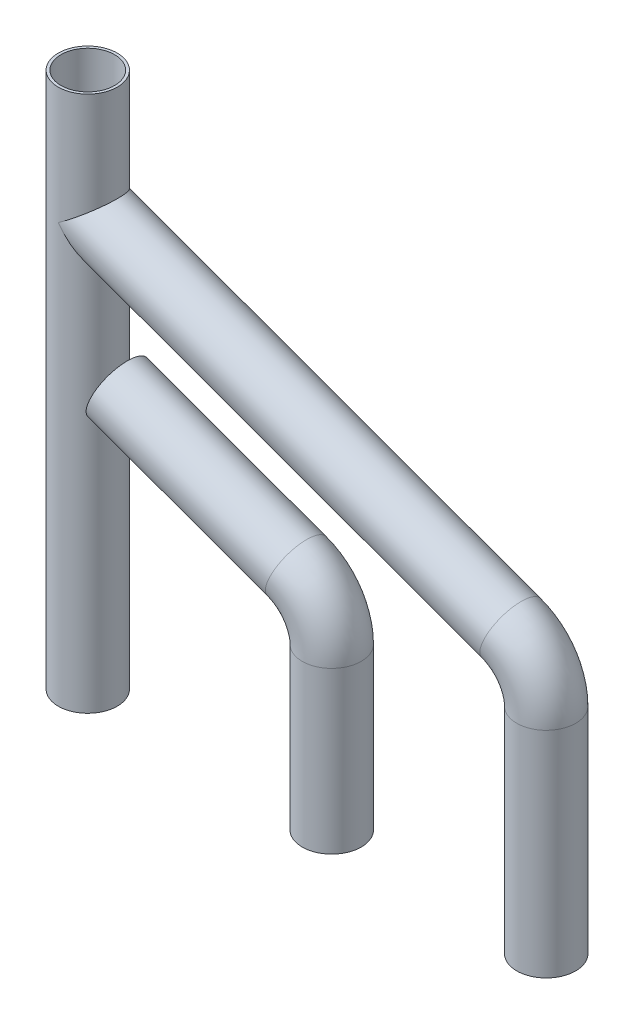
ISO-10303-21;
HEADER;
FILE_DESCRIPTION(('STEP AP214'),'2;1');
FILE_NAME('part.step','',(''),(''),'','','');
FILE_SCHEMA(('AUTOMOTIVE_DESIGN { 1 0 10303 214 1 1 1 1 }'));
ENDSEC;
DATA;
#1=APPLICATION_CONTEXT('core data for automotive mechanical design processes');
#2=APPLICATION_PROTOCOL_DEFINITION('international standard','automotive_design',2000,#1);
#3=PRODUCT_CONTEXT('',#1,'mechanical');
#4=PRODUCT('Part','Part','',(#3));
#5=PRODUCT_RELATED_PRODUCT_CATEGORY('part','',(#4));
#6=PRODUCT_DEFINITION_FORMATION('','',#4);
#7=PRODUCT_DEFINITION_CONTEXT('part definition',#1,'design');
#8=PRODUCT_DEFINITION('design','',#6,#7);
#9=PRODUCT_DEFINITION_SHAPE('','',#8);
#10=(LENGTH_UNIT() NAMED_UNIT(*) SI_UNIT(.MILLI.,.METRE.));
#11=(NAMED_UNIT(*) PLANE_ANGLE_UNIT() SI_UNIT($,.RADIAN.));
#12=(NAMED_UNIT(*) SI_UNIT($,.STERADIAN.) SOLID_ANGLE_UNIT());
#13=UNCERTAINTY_MEASURE_WITH_UNIT(LENGTH_MEASURE(1.E-05),#10,'distance_accuracy_value','');
#14=(GEOMETRIC_REPRESENTATION_CONTEXT(3) GLOBAL_UNCERTAINTY_ASSIGNED_CONTEXT((#13)) GLOBAL_UNIT_ASSIGNED_CONTEXT((#10,
#11,#12)) REPRESENTATION_CONTEXT('',''));
#15=CARTESIAN_POINT('',(0.,0.,0.));
#16=DIRECTION('',(0.,0.,1.));
#17=DIRECTION('',(1.,0.,0.));
#18=AXIS2_PLACEMENT_3D('',#15,#16,#17);
#19=CARTESIAN_POINT('',(0.,127.,0.));
#20=DIRECTION('',(0.,-1.,0.));
#21=DIRECTION('',(0.,0.,-1.));
#22=AXIS2_PLACEMENT_3D('',#19,#20,#21);
#23=CYLINDRICAL_SURFACE('',#22,6.985);
#24=CARTESIAN_POINT('',(0.,46.2911938610954,0.));
#25=DIRECTION('',(0.939692620785909,-0.342020143325665,0.));
#26=DIRECTION('',(-0.342020143325666,-0.93969262078591,0.));
#27=AXIS2_PLACEMENT_3D('',#24,#25,#26);
#28=ELLIPSE('',#27,20.4227737351394,6.985);
#29=CARTESIAN_POINT('',(5.20483990850574,60.5913739815914,-4.65831155321604));
#30=VERTEX_POINT('',#29);
#31=CARTESIAN_POINT('',(5.42076742573765,61.1846299594249,-4.40516804629082));
#32=VERTEX_POINT('',#31);
#33=EDGE_CURVE('E231',#30,#32,#28,.T.);
#34=ORIENTED_EDGE('',*,*,#33,.F.);
#35=CARTESIAN_POINT('',(0.,68.0246557223356,0.));
#36=DIRECTION('',(-0.819152044288991,-0.573576436351047,0.));
#37=DIRECTION('',(0.573576436351047,-0.819152044288991,0.));
#38=AXIS2_PLACEMENT_3D('',#35,#36,#37);
#39=ELLIPSE('',#38,12.1779758674133,6.985);
#40=CARTESIAN_POINT('',(5.20483990850574,60.5913739815914,4.65831155321604));
#41=VERTEX_POINT('',#40);
#42=EDGE_CURVE('E276',#30,#41,#39,.T.);
#43=ORIENTED_EDGE('',*,*,#42,.T.);
#44=CARTESIAN_POINT('',(5.42076742573765,61.1846299594249,4.40516804629082));
#45=VERTEX_POINT('',#44);
#46=EDGE_CURVE('E149',#45,#41,#28,.T.);
#47=ORIENTED_EDGE('',*,*,#46,.F.);
#48=CARTESIAN_POINT('',(5.42076742573765,61.1846299594249,4.40516804629082));
#49=CARTESIAN_POINT('',(5.50688476329087,61.0446768816568,4.2991595484523));
#50=CARTESIAN_POINT('',(5.59186751407775,60.9075905049412,4.18826555741038));
#51=CARTESIAN_POINT('',(5.75869826296238,60.6400722078168,3.95578485884568));
#52=CARTESIAN_POINT('',(5.84053801573785,60.5096575272873,3.83417246250436));
#53=CARTESIAN_POINT('',(6.00092421308625,60.2552946102483,3.57802532963901));
#54=CARTESIAN_POINT('',(6.07940656763278,60.1314659834554,3.44333023636312));
#55=CARTESIAN_POINT('',(6.2303129400432,59.8942942403671,3.16209977708398));
#56=CARTESIAN_POINT('',(6.30274303173212,59.7809405993639,3.01557657895226));
#57=CARTESIAN_POINT('',(6.46417361376778,59.529076830873,2.65630250007065));
#58=CARTESIAN_POINT('',(6.55003480432772,59.3957529415076,2.43839182053198));
#59=CARTESIAN_POINT('',(6.70240237685557,59.1598153309443,1.98131538364937));
#60=CARTESIAN_POINT('',(6.76900042859199,59.0570560896182,1.74225761042003));
#61=CARTESIAN_POINT('',(6.86899373953028,58.9030161027488,1.28556041608288));
#62=CARTESIAN_POINT('',(6.90600046468739,58.8461232897926,1.07063219773384));
#63=CARTESIAN_POINT('',(6.95982497029777,58.76342534716,0.632243326124323));
#64=CARTESIAN_POINT('',(6.97664301159798,58.7376198158218,0.408782783143841));
#65=CARTESIAN_POINT('',(6.98850442034003,58.719416537717,-0.0406016039630629));
#66=CARTESIAN_POINT('',(6.98349961319687,58.7270927028,-0.266529798582886));
#67=CARTESIAN_POINT('',(6.95209695756699,58.775301628972,-0.713290725597633));
#68=CARTESIAN_POINT('',(6.92569343044529,58.815843111618,-0.934122089432437));
#69=CARTESIAN_POINT('',(6.85486007246428,58.9247855870537,-1.35875353236183));
#70=CARTESIAN_POINT('',(6.81096168126243,58.9923654563658,-1.56285876975073));
#71=CARTESIAN_POINT('',(6.70818111059067,59.1509554162643,-1.9576068612387));
#72=CARTESIAN_POINT('',(6.64929164897342,59.2419768942314,-2.14824311490644));
#73=CARTESIAN_POINT('',(6.47995821235158,59.5044909813695,-2.62645347994145));
#74=CARTESIAN_POINT('',(6.35996105626465,59.6912285530938,-2.90234238748409));
#75=CARTESIAN_POINT('',(6.16480851476371,59.9971310331551,-3.28728051255804));
#76=CARTESIAN_POINT('',(6.09709467440028,60.1036148923938,-3.4109755883476));
#77=CARTESIAN_POINT('',(5.95757719412675,60.3239342487393,-3.64917923777665));
#78=CARTESIAN_POINT('',(5.88577492046966,60.4377672916135,-3.76369084984947));
#79=CARTESIAN_POINT('',(5.74897668998996,60.6557276826904,-3.96895248165094));
#80=CARTESIAN_POINT('',(5.68438256843467,60.7590704858003,-4.06081639635945));
#81=CARTESIAN_POINT('',(5.55367467136597,60.969247684641,-4.2377961594257));
#82=CARTESIAN_POINT('',(5.4875715983186,61.0760589412241,-4.32294733980366));
#83=CARTESIAN_POINT('',(5.42076742573765,61.1846299594249,-4.40516804629082));
#84=B_SPLINE_CURVE_WITH_KNOTS('',3,(#48,#49,#50,#51,#52,#53,#54,#55,#56,#57,#58,#59,#60,#61,#62,
#63,#64,#65,#66,#67,#68,#69,#70,#71,#72,#73,#74,#75,#76,#77,#78,#79,#80,#81,#82,#83),
.UNSPECIFIED.,.F.,.F.,(4,2,2,2,2,2,2,2,2,2,2,2,2,2,2,2,2,4),(0.,0.586715328396354,
1.17487720437648,1.77147695220902,2.36747059830207,3.17321421263089,3.97505786062355,
4.64834108003487,5.3216156002283,5.99637714544563,6.67131781257588,7.32715250916561,
7.98330639769698,9.03914043409059,9.56898575857942,10.0986550493681,10.5563126547145,
11.0113734318815),.UNSPECIFIED.);
#85=EDGE_CURVE('E124',#45,#32,#84,.T.);
#86=ORIENTED_EDGE('',*,*,#85,.T.);
#87=EDGE_LOOP('',(#34,#43,#47,#86));
#88=FACE_BOUND('',#87,.T.);
#89=CARTESIAN_POINT('',(0.,0.,0.));
#90=DIRECTION('',(0.,1.,0.));
#91=DIRECTION('',(0.,0.,1.));
#92=AXIS2_PLACEMENT_3D('',#89,#90,#91);
#93=CIRCLE('',#92,6.985);
#94=CARTESIAN_POINT('',(0.,0.,6.985));
#95=VERTEX_POINT('',#94);
#96=EDGE_CURVE('E234',#95,#95,#93,.T.);
#97=ORIENTED_EDGE('',*,*,#96,.T.);
#98=EDGE_LOOP('',(#97));
#99=FACE_BOUND('',#98,.T.);
#100=CARTESIAN_POINT('',(0.,127.,0.));
#101=DIRECTION('',(0.,1.,0.));
#102=DIRECTION('',(0.,0.,1.));
#103=AXIS2_PLACEMENT_3D('',#100,#101,#102);
#104=CIRCLE('',#103,6.985);
#105=CARTESIAN_POINT('',(0.,127.,6.985));
#106=VERTEX_POINT('',#105);
#107=EDGE_CURVE('E104',#106,#106,#104,.T.);
#108=ORIENTED_EDGE('',*,*,#107,.F.);
#109=EDGE_LOOP('',(#108));
#110=FACE_BOUND('',#109,.T.);
#111=CARTESIAN_POINT('',(0.,99.2143436230586,0.));
#112=DIRECTION('',(0.573576436351047,-0.819152044288991,0.));
#113=DIRECTION('',(0.819152044288991,0.573576436351047,0.));
#114=AXIS2_PLACEMENT_3D('',#111,#112,#113);
#115=ELLIPSE('',#114,8.52711050249878,6.985);
#116=CARTESIAN_POINT('',(0.,99.2143436230586,6.985));
#117=VERTEX_POINT('',#116);
#118=CARTESIAN_POINT('',(0.,99.2143436230586,-6.985));
#119=VERTEX_POINT('',#118);
#120=EDGE_CURVE('E239',#117,#119,#115,.F.);
#121=ORIENTED_EDGE('',*,*,#120,.T.);
#122=CARTESIAN_POINT('',(0.,99.2143436230586,0.));
#123=DIRECTION('',(0.819152044288991,0.573576436351047,0.));
#124=DIRECTION('',(0.573576436351047,-0.819152044288991,0.));
#125=AXIS2_PLACEMENT_3D('',#122,#123,#124);
#126=ELLIPSE('',#125,12.1779758674134,6.985);
#127=EDGE_CURVE('E241',#119,#117,#126,.F.);
#128=ORIENTED_EDGE('',*,*,#127,.T.);
#129=EDGE_LOOP('',(#121,#128));
#130=FACE_BOUND('',#129,.T.);
#131=ADVANCED_FACE('F39',(#88,#99,#110,#130),#23,.T.);
#132=CARTESIAN_POINT('',(0.,127.,0.));
#133=DIRECTION('',(0.,1.,0.));
#134=DIRECTION('',(0.,0.,1.));
#135=AXIS2_PLACEMENT_3D('',#132,#133,#134);
#136=PLANE('',#135);
#137=ORIENTED_EDGE('',*,*,#107,.T.);
#138=EDGE_LOOP('',(#137));
#139=FACE_BOUND('',#138,.T.);
#140=CARTESIAN_POINT('',(0.,127.,0.));
#141=DIRECTION('',(0.,1.,0.));
#142=DIRECTION('',(0.,0.,1.));
#143=AXIS2_PLACEMENT_3D('',#140,#141,#142);
#144=CIRCLE('',#143,6.35);
#145=CARTESIAN_POINT('',(0.,127.,6.35));
#146=VERTEX_POINT('',#145);
#147=EDGE_CURVE('E255',#146,#146,#144,.T.);
#148=ORIENTED_EDGE('',*,*,#147,.F.);
#149=EDGE_LOOP('',(#148));
#150=FACE_BOUND('',#149,.T.);
#151=ADVANCED_FACE('F215',(#139,#150),#136,.T.);
#152=CARTESIAN_POINT('',(0.,0.,0.));
#153=DIRECTION('',(0.,1.,0.));
#154=DIRECTION('',(0.,0.,1.));
#155=AXIS2_PLACEMENT_3D('',#152,#153,#154);
#156=PLANE('',#155);
#157=ORIENTED_EDGE('',*,*,#96,.F.);
#158=EDGE_LOOP('',(#157));
#159=FACE_BOUND('',#158,.T.);
#160=CARTESIAN_POINT('',(0.,0.,0.));
#161=DIRECTION('',(0.,1.,0.));
#162=DIRECTION('',(0.,0.,1.));
#163=AXIS2_PLACEMENT_3D('',#160,#161,#162);
#164=CIRCLE('',#163,6.35);
#165=CARTESIAN_POINT('',(0.,0.,6.35));
#166=VERTEX_POINT('',#165);
#167=EDGE_CURVE('E244',#166,#166,#164,.T.);
#168=ORIENTED_EDGE('',*,*,#167,.T.);
#169=EDGE_LOOP('',(#168));
#170=FACE_BOUND('',#169,.T.);
#171=ADVANCED_FACE('F214',(#159,#170),#156,.F.);
#172=CARTESIAN_POINT('',(0.,127.,0.));
#173=DIRECTION('',(0.,-1.,0.));
#174=DIRECTION('',(0.,0.,-1.));
#175=AXIS2_PLACEMENT_3D('',#172,#173,#174);
#176=CYLINDRICAL_SURFACE('',#175,6.35);
#177=CARTESIAN_POINT('',(5.0049158192397,60.0420870607279,-3.90810921576205));
#178=CARTESIAN_POINT('',(5.08385606799134,59.9407286148073,-3.80698559348898));
#179=CARTESIAN_POINT('',(5.16082988385636,59.8414667317882,-3.70211774814221));
#180=CARTESIAN_POINT('',(5.31030353800544,59.6480301890913,-3.48435323397352));
#181=CARTESIAN_POINT('',(5.38279480705176,59.5538653136675,-3.37144202428596));
#182=CARTESIAN_POINT('',(5.52331320639667,59.3707949696802,-3.13600063292745));
#183=CARTESIAN_POINT('',(5.59127534547316,59.2819673651016,-3.01337019312205));
#184=CARTESIAN_POINT('',(5.72075966167736,59.1123100048451,-2.75965881722264));
#185=CARTESIAN_POINT('',(5.78228635117791,59.0314746474143,-2.62858390780557));
#186=CARTESIAN_POINT('',(5.92946095159041,58.8377257089803,-2.28378042853145));
#187=CARTESIAN_POINT('',(6.00997181790212,58.7313502462922,-2.06394956234707));
#188=CARTESIAN_POINT('',(6.11357547136943,58.5941945264978,-1.72074447343747));
#189=CARTESIAN_POINT('',(6.14521625712623,58.5522549482604,-1.60427724899508));
#190=CARTESIAN_POINT('',(6.2022559788411,58.4765873514537,-1.36724246469711));
#191=CARTESIAN_POINT('',(6.22765825642912,58.4428549368432,-1.24667713954541));
#192=CARTESIAN_POINT('',(6.27191424697458,58.384052086628,-1.00069675824917));
#193=CARTESIAN_POINT('',(6.29068642788144,58.3590895145703,-0.875241061647269));
#194=CARTESIAN_POINT('',(6.32076429955983,58.3190792482825,-0.621859652878643));
#195=CARTESIAN_POINT('',(6.33206998977784,58.3040315547875,-0.493933940528793));
#196=CARTESIAN_POINT('',(6.34688862870993,58.2843060938381,-0.236824840624406));
#197=CARTESIAN_POINT('',(6.35040120803355,58.2796288179376,-0.10764139374522));
#198=CARTESIAN_POINT('',(6.34952599790323,58.2807940883773,0.150640983902896));
#199=CARTESIAN_POINT('',(6.34513915400963,58.2866353756464,0.279739922937021));
#200=CARTESIAN_POINT('',(6.32985987079575,58.3069729022552,0.516991228406411));
#201=CARTESIAN_POINT('',(6.32005853889201,58.3200174299026,0.625342661853248));
#202=CARTESIAN_POINT('',(6.29508307074311,58.3532415423524,0.840331987738451));
#203=CARTESIAN_POINT('',(6.27990733337266,58.3734232534388,0.946969359621381));
#204=CARTESIAN_POINT('',(6.22674390771235,58.444080216758,1.26323045597385));
#205=CARTESIAN_POINT('',(6.18110723987018,58.5046843497347,1.46939023563389));
#206=CARTESIAN_POINT('',(6.05373182421668,58.6734866826493,1.93704729773584));
#207=CARTESIAN_POINT('',(5.96497780735352,58.7908813438372,2.19324628185005));
#208=CARTESIAN_POINT('',(5.76320060332802,59.0566694572565,2.67910767251587));
#209=CARTESIAN_POINT('',(5.65010025146558,59.2051614295427,2.9086820484076));
#210=CARTESIAN_POINT('',(5.44751146856906,59.4696720351872,3.26709006311268));
#211=CARTESIAN_POINT('',(5.36312468733902,59.5794948490803,3.40357918076869));
#212=CARTESIAN_POINT('',(5.18833987716769,59.8059757457476,3.66441904083326));
#213=CARTESIAN_POINT('',(5.0979928738444,59.9225749937717,3.78885479314942));
#214=CARTESIAN_POINT('',(5.0049158192397,60.0420870607279,3.90810921576205));
#215=B_SPLINE_CURVE_WITH_KNOTS('',3,(#177,#178,#179,#180,#181,#182,#183,#184,#185,#186,#187,
#188,#189,#190,#191,#192,#193,#194,#195,#196,#197,#198,#199,#200,#201,#202,#203,#204,#205,#206,
#207,#208,#209,#210,#211,#212,#213,#214),.UNSPECIFIED.,.F.,.F.,(4,2,2,2,2,2,2,2,2,2,2,2,2,2,2,2,
2,2,4),(0.,0.490516762200895,0.981943962763192,1.47934599709468,1.97639689424849,
2.7444347843961,3.12735092138705,3.51006150144605,3.89732670737416,4.28459194201308,
4.67187553248374,5.05911276822112,5.38744532764112,5.71587578522196,6.37217869007555,
7.2537806747293,8.13821911903218,8.72103277853289,9.29937985005367),.UNSPECIFIED.);
#216=CARTESIAN_POINT('',(5.0049158192397,60.0420870607279,-3.90810921576204));
#217=VERTEX_POINT('',#216);
#218=CARTESIAN_POINT('',(5.0049158192397,60.0420870607279,3.90810921576204));
#219=VERTEX_POINT('',#218);
#220=EDGE_CURVE('E11',#217,#219,#215,.T.);
#221=ORIENTED_EDGE('',*,*,#220,.F.);
#222=CARTESIAN_POINT('',(0.,46.2911938610954,0.));
#223=DIRECTION('',(0.939692620785909,-0.342020143325665,0.));
#224=DIRECTION('',(-0.342020143325666,-0.93969262078591,0.));
#225=AXIS2_PLACEMENT_3D('',#222,#223,#224);
#226=ELLIPSE('',#225,18.5661579410358,6.35);
#227=CARTESIAN_POINT('',(5.20483990850574,60.5913739815914,-3.63760106757544));
#228=VERTEX_POINT('',#227);
#229=EDGE_CURVE('E54',#217,#228,#226,.T.);
#230=ORIENTED_EDGE('',*,*,#229,.T.);
#231=CARTESIAN_POINT('',(0.,68.0246557223356,0.));
#232=DIRECTION('',(-0.819152044288991,-0.573576436351047,0.));
#233=DIRECTION('',(0.573576436351047,-0.819152044288991,0.));
#234=AXIS2_PLACEMENT_3D('',#231,#232,#233);
#235=ELLIPSE('',#234,11.070887152194,6.35);
#236=CARTESIAN_POINT('',(5.20483990850574,60.5913739815914,3.63760106757544));
#237=VERTEX_POINT('',#236);
#238=EDGE_CURVE('E91',#237,#228,#235,.F.);
#239=ORIENTED_EDGE('',*,*,#238,.F.);
#240=EDGE_CURVE('E98',#237,#219,#226,.T.);
#241=ORIENTED_EDGE('',*,*,#240,.T.);
#242=EDGE_LOOP('',(#221,#230,#239,#241));
#243=FACE_BOUND('',#242,.T.);
#244=ORIENTED_EDGE('',*,*,#147,.T.);
#245=EDGE_LOOP('',(#244));
#246=FACE_BOUND('',#245,.T.);
#247=ORIENTED_EDGE('',*,*,#167,.F.);
#248=EDGE_LOOP('',(#247));
#249=FACE_BOUND('',#248,.T.);
#250=ADVANCED_FACE('F89',(#243,#246,#249),#176,.F.);
#251=CARTESIAN_POINT('',(-15.0992524566723,104.710022076958,0.));
#252=DIRECTION('',(0.939692620785909,-0.342020143325666,0.));
#253=DIRECTION('',(0.342020143325666,0.939692620785909,0.));
#254=AXIS2_PLACEMENT_3D('',#251,#252,#253);
#255=CYLINDRICAL_SURFACE('',#254,6.985);
#256=CARTESIAN_POINT('',(100.228655820236,62.7340962839811,0.));
#257=DIRECTION('',(-0.939692620785909,0.342020143325666,0.));
#258=DIRECTION('',(-0.342020143325666,-0.939692620785909,0.));
#259=AXIS2_PLACEMENT_3D('',#256,#257,#258);
#260=CIRCLE('',#259,6.985);
#261=CARTESIAN_POINT('',(102.617666521366,69.2978492401706,0.));
#262=VERTEX_POINT('',#261);
#263=EDGE_CURVE('E247',#262,#262,#260,.T.);
#264=ORIENTED_EDGE('',*,*,#263,.T.);
#265=EDGE_LOOP('',(#264));
#266=FACE_BOUND('',#265,.T.);
#267=ORIENTED_EDGE('',*,*,#120,.F.);
#268=ORIENTED_EDGE('',*,*,#127,.F.);
#269=EDGE_LOOP('',(#267,#268));
#270=FACE_BOUND('',#269,.T.);
#271=ADVANCED_FACE('F194',(#266,#270),#255,.T.);
#272=CARTESIAN_POINT('',(95.885,50.8,0.));
#273=DIRECTION('',(0.,0.,-1.));
#274=DIRECTION('',(-1.,0.,0.));
#275=AXIS2_PLACEMENT_3D('',#272,#273,#274);
#276=TOROIDAL_SURFACE('',#275,12.7,6.985);
#277=CARTESIAN_POINT('',(108.585,50.8,0.));
#278=DIRECTION('',(0.,-1.,0.));
#279=DIRECTION('',(0.,0.,-1.));
#280=AXIS2_PLACEMENT_3D('',#277,#278,#279);
#281=CIRCLE('',#280,6.985);
#282=CARTESIAN_POINT('',(115.57,50.8,0.));
#283=VERTEX_POINT('',#282);
#284=EDGE_CURVE('E271',#283,#283,#281,.T.);
#285=CARTESIAN_POINT('',(95.885,50.8,0.));
#286=DIRECTION('',(0.,0.,-1.));
#287=DIRECTION('',(-1.,0.,0.));
#288=AXIS2_PLACEMENT_3D('',#285,#286,#287);
#289=CIRCLE('',#288,19.685);
#290=EDGE_CURVE('',#262,#283,#289,.T.);
#291=ORIENTED_EDGE('',*,*,#263,.F.);
#292=ORIENTED_EDGE('',*,*,#284,.F.);
#293=ORIENTED_EDGE('',*,*,#290,.T.);
#294=ORIENTED_EDGE('',*,*,#290,.F.);
#295=EDGE_LOOP('',(#291,#293,#292,#294));
#296=FACE_BOUND('',#295,.T.);
#297=ADVANCED_FACE('F199',(#296),#276,.T.);
#298=CARTESIAN_POINT('',(108.585,50.8,0.));
#299=DIRECTION('',(0.,-1.,0.));
#300=DIRECTION('',(0.,0.,-1.));
#301=AXIS2_PLACEMENT_3D('',#298,#299,#300);
#302=CYLINDRICAL_SURFACE('',#301,6.985);
#303=CARTESIAN_POINT('',(108.585,0.,0.));
#304=DIRECTION('',(0.,-1.,0.));
#305=DIRECTION('',(0.,0.,-1.));
#306=AXIS2_PLACEMENT_3D('',#303,#304,#305);
#307=CIRCLE('',#306,6.985);
#308=CARTESIAN_POINT('',(108.585,0.,-6.985));
#309=VERTEX_POINT('',#308);
#310=EDGE_CURVE('E275',#309,#309,#307,.T.);
#311=ORIENTED_EDGE('',*,*,#310,.F.);
#312=EDGE_LOOP('',(#311));
#313=FACE_BOUND('',#312,.T.);
#314=ORIENTED_EDGE('',*,*,#284,.T.);
#315=EDGE_LOOP('',(#314));
#316=FACE_BOUND('',#315,.T.);
#317=ADVANCED_FACE('F197',(#313,#316),#302,.T.);
#318=CARTESIAN_POINT('',(108.585,0.,0.));
#319=DIRECTION('',(0.,-1.,0.));
#320=DIRECTION('',(0.,0.,-1.));
#321=AXIS2_PLACEMENT_3D('',#318,#319,#320);
#322=PLANE('',#321);
#323=CARTESIAN_POINT('',(108.585,0.,0.));
#324=DIRECTION('',(0.,-1.,0.));
#325=DIRECTION('',(0.,0.,-1.));
#326=AXIS2_PLACEMENT_3D('',#323,#324,#325);
#327=CIRCLE('',#326,6.35);
#328=CARTESIAN_POINT('',(108.585,0.,-6.35));
#329=VERTEX_POINT('',#328);
#330=EDGE_CURVE('E251',#329,#329,#327,.F.);
#331=ORIENTED_EDGE('',*,*,#330,.T.);
#332=EDGE_LOOP('',(#331));
#333=FACE_BOUND('',#332,.T.);
#334=ORIENTED_EDGE('',*,*,#310,.T.);
#335=EDGE_LOOP('',(#334));
#336=FACE_BOUND('',#335,.T.);
#337=ADVANCED_FACE('F189',(#333,#336),#322,.T.);
#338=CARTESIAN_POINT('',(95.885,50.8,0.));
#339=DIRECTION('',(0.,0.,-1.));
#340=DIRECTION('',(-1.,0.,0.));
#341=AXIS2_PLACEMENT_3D('',#338,#339,#340);
#342=TOROIDAL_SURFACE('',#341,12.7,6.35);
#343=CARTESIAN_POINT('',(100.228655820236,62.7340962839811,0.));
#344=DIRECTION('',(0.939692620785909,-0.342020143325666,0.));
#345=DIRECTION('',(0.,0.,-1.));
#346=AXIS2_PLACEMENT_3D('',#343,#344,#345);
#347=CIRCLE('',#346,6.35);
#348=CARTESIAN_POINT('',(102.400483730354,68.7011444259716,0.));
#349=VERTEX_POINT('',#348);
#350=EDGE_CURVE('E280',#349,#349,#347,.F.);
#351=CARTESIAN_POINT('',(108.585,50.8,0.));
#352=DIRECTION('',(0.,-1.,0.));
#353=DIRECTION('',(0.,0.,-1.));
#354=AXIS2_PLACEMENT_3D('',#351,#352,#353);
#355=CIRCLE('',#354,6.35);
#356=CARTESIAN_POINT('',(114.935,50.8,0.));
#357=VERTEX_POINT('',#356);
#358=EDGE_CURVE('E284',#357,#357,#355,.F.);
#359=CARTESIAN_POINT('',(95.885,50.8,0.));
#360=DIRECTION('',(0.,0.,-1.));
#361=DIRECTION('',(-1.,0.,0.));
#362=AXIS2_PLACEMENT_3D('',#359,#360,#361);
#363=CIRCLE('',#362,19.05);
#364=EDGE_CURVE('',#349,#357,#363,.T.);
#365=ORIENTED_EDGE('',*,*,#350,.T.);
#366=ORIENTED_EDGE('',*,*,#358,.F.);
#367=ORIENTED_EDGE('',*,*,#364,.T.);
#368=ORIENTED_EDGE('',*,*,#364,.F.);
#369=EDGE_LOOP('',(#365,#367,#366,#368));
#370=FACE_BOUND('',#369,.T.);
#371=ADVANCED_FACE('F185',(#370),#342,.F.);
#372=CARTESIAN_POINT('',(108.585,50.8,0.));
#373=DIRECTION('',(0.,-1.,0.));
#374=DIRECTION('',(0.,0.,-1.));
#375=AXIS2_PLACEMENT_3D('',#372,#373,#374);
#376=CYLINDRICAL_SURFACE('',#375,6.35);
#377=ORIENTED_EDGE('',*,*,#330,.F.);
#378=EDGE_LOOP('',(#377));
#379=FACE_BOUND('',#378,.T.);
#380=ORIENTED_EDGE('',*,*,#358,.T.);
#381=EDGE_LOOP('',(#380));
#382=FACE_BOUND('',#381,.T.);
#383=ADVANCED_FACE('F188',(#379,#382),#376,.F.);
#384=CARTESIAN_POINT('',(100.228655820236,62.7340962839811,0.));
#385=DIRECTION('',(-0.939692620785909,0.342020143325666,0.));
#386=DIRECTION('',(-0.342020143325666,-0.939692620785909,0.));
#387=AXIS2_PLACEMENT_3D('',#384,#385,#386);
#388=PLANE('',#387);
#389=ORIENTED_EDGE('',*,*,#350,.F.);
#390=EDGE_LOOP('',(#389));
#391=FACE_BOUND('',#390,.T.);
#392=ADVANCED_FACE('F154',(#391),#388,.F.);
#393=CARTESIAN_POINT('',(6.98500000000002,65.4823236359862,0.));
#394=DIRECTION('',(0.93969262078591,-0.342020143325666,0.));
#395=DIRECTION('',(0.342020143325666,0.93969262078591,0.));
#396=AXIS2_PLACEMENT_3D('',#393,#394,#395);
#397=CYLINDRICAL_SURFACE('',#396,6.35);
#398=CARTESIAN_POINT('',(6.98500000000002,65.4823236359862,0.));
#399=DIRECTION('',(0.939692620785909,-0.342020143325665,0.));
#400=DIRECTION('',(0.,0.,-1.));
#401=AXIS2_PLACEMENT_3D('',#398,#399,#400);
#402=CIRCLE('',#401,6.35);
#403=EDGE_CURVE('E102',#228,#237,#402,.F.);
#404=ORIENTED_EDGE('',*,*,#403,.T.);
#405=ORIENTED_EDGE('',*,*,#238,.T.);
#406=EDGE_LOOP('',(#404,#405));
#407=FACE_BOUND('',#406,.T.);
#408=ADVANCED_FACE('F101',(#407),#397,.F.);
#409=CARTESIAN_POINT('',(6.98500000000002,65.4823236359862,0.));
#410=DIRECTION('',(0.939692620785909,-0.342020143325665,0.));
#411=DIRECTION('',(0.,0.,-1.));
#412=AXIS2_PLACEMENT_3D('',#409,#410,#411);
#413=PLANE('',#412);
#414=ORIENTED_EDGE('',*,*,#229,.F.);
#415=CARTESIAN_POINT('',(6.98500000000002,65.4823236359862,0.));
#416=DIRECTION('',(0.939692620785909,-0.342020143325665,0.));
#417=DIRECTION('',(0.,0.,-1.));
#418=AXIS2_PLACEMENT_3D('',#415,#416,#417);
#419=CIRCLE('',#418,6.985);
#420=EDGE_CURVE('E128',#219,#217,#419,.T.);
#421=ORIENTED_EDGE('',*,*,#420,.F.);
#422=ORIENTED_EDGE('',*,*,#240,.F.);
#423=ORIENTED_EDGE('',*,*,#403,.F.);
#424=EDGE_LOOP('',(#414,#421,#422,#423));
#425=FACE_BOUND('',#424,.T.);
#426=ADVANCED_FACE('F106',(#425),#413,.F.);
#427=CARTESIAN_POINT('',(6.98500000000002,65.4823236359862,0.));
#428=DIRECTION('',(0.93969262078591,-0.342020143325666,0.));
#429=DIRECTION('',(0.342020143325666,0.93969262078591,0.));
#430=AXIS2_PLACEMENT_3D('',#427,#428,#429);
#431=CYLINDRICAL_SURFACE('',#430,6.985);
#432=ORIENTED_EDGE('',*,*,#420,.T.);
#433=ORIENTED_EDGE('',*,*,#220,.T.);
#434=EDGE_LOOP('',(#432,#433));
#435=FACE_BOUND('',#434,.T.);
#436=ADVANCED_FACE('F172',(#435),#431,.T.);
#437=CARTESIAN_POINT('',(49.428655820236,50.0340962839811,0.));
#438=DIRECTION('',(0.939692620785909,-0.342020143325665,0.));
#439=DIRECTION('',(0.,0.,-1.));
#440=AXIS2_PLACEMENT_3D('',#437,#438,#439);
#441=CIRCLE('',#440,6.985);
#442=CARTESIAN_POINT('',(51.8176665213658,56.5978492401706,0.));
#443=VERTEX_POINT('',#442);
#444=EDGE_CURVE('E134',#443,#443,#441,.T.);
#445=ORIENTED_EDGE('',*,*,#444,.F.);
#446=EDGE_LOOP('',(#445));
#447=FACE_BOUND('',#446,.T.);
#448=ORIENTED_EDGE('',*,*,#42,.F.);
#449=EDGE_CURVE('E129',#30,#41,#419,.T.);
#450=ORIENTED_EDGE('',*,*,#449,.T.);
#451=EDGE_LOOP('',(#448,#450));
#452=FACE_BOUND('',#451,.T.);
#453=ADVANCED_FACE('F176',(#447,#452),#431,.T.);
#454=CARTESIAN_POINT('',(49.428655820236,50.0340962839811,0.));
#455=DIRECTION('',(0.939692620785909,-0.342020143325665,0.));
#456=DIRECTION('',(0.,0.,-1.));
#457=AXIS2_PLACEMENT_3D('',#454,#455,#456);
#458=CIRCLE('',#457,6.35);
#459=CARTESIAN_POINT('',(51.600483730354,56.0011444259716,0.));
#460=VERTEX_POINT('',#459);
#461=EDGE_CURVE('E108',#460,#460,#458,.F.);
#462=ORIENTED_EDGE('',*,*,#461,.F.);
#463=EDGE_LOOP('',(#462));
#464=FACE_BOUND('',#463,.T.);
#465=ORIENTED_EDGE('',*,*,#85,.F.);
#466=EDGE_CURVE('E60',#45,#32,#402,.F.);
#467=ORIENTED_EDGE('',*,*,#466,.T.);
#468=EDGE_LOOP('',(#465,#467));
#469=FACE_BOUND('',#468,.T.);
#470=ADVANCED_FACE('F155',(#464,#469),#397,.F.);
#471=CARTESIAN_POINT('',(45.085,38.1,0.));
#472=DIRECTION('',(0.,0.,-1.));
#473=DIRECTION('',(-1.,0.,0.));
#474=AXIS2_PLACEMENT_3D('',#471,#472,#473);
#475=TOROIDAL_SURFACE('',#474,12.7,6.985);
#476=CARTESIAN_POINT('',(57.785,38.1,0.));
#477=DIRECTION('',(0.,-1.,0.));
#478=DIRECTION('',(0.,0.,-1.));
#479=AXIS2_PLACEMENT_3D('',#476,#477,#478);
#480=CIRCLE('',#479,6.985);
#481=CARTESIAN_POINT('',(64.77,38.1,0.));
#482=VERTEX_POINT('',#481);
#483=EDGE_CURVE('E133',#482,#482,#480,.T.);
#484=CARTESIAN_POINT('',(45.085,38.1,0.));
#485=DIRECTION('',(0.,0.,-1.));
#486=DIRECTION('',(-1.,0.,0.));
#487=AXIS2_PLACEMENT_3D('',#484,#485,#486);
#488=CIRCLE('',#487,19.685);
#489=EDGE_CURVE('',#443,#482,#488,.T.);
#490=ORIENTED_EDGE('',*,*,#444,.T.);
#491=ORIENTED_EDGE('',*,*,#483,.F.);
#492=ORIENTED_EDGE('',*,*,#489,.T.);
#493=ORIENTED_EDGE('',*,*,#489,.F.);
#494=EDGE_LOOP('',(#490,#492,#491,#493));
#495=FACE_BOUND('',#494,.T.);
#496=ADVANCED_FACE('F178',(#495),#475,.T.);
#497=CARTESIAN_POINT('',(57.785,38.1,0.));
#498=DIRECTION('',(0.,-1.,0.));
#499=DIRECTION('',(0.,0.,-1.));
#500=AXIS2_PLACEMENT_3D('',#497,#498,#499);
#501=CYLINDRICAL_SURFACE('',#500,6.985);
#502=CARTESIAN_POINT('',(57.785,0.,0.));
#503=DIRECTION('',(0.,-1.,0.));
#504=DIRECTION('',(0.,0.,-1.));
#505=AXIS2_PLACEMENT_3D('',#502,#503,#504);
#506=CIRCLE('',#505,6.985);
#507=CARTESIAN_POINT('',(57.785,0.,-6.985));
#508=VERTEX_POINT('',#507);
#509=EDGE_CURVE('E115',#508,#508,#506,.T.);
#510=ORIENTED_EDGE('',*,*,#509,.F.);
#511=EDGE_LOOP('',(#510));
#512=FACE_BOUND('',#511,.T.);
#513=ORIENTED_EDGE('',*,*,#483,.T.);
#514=EDGE_LOOP('',(#513));
#515=FACE_BOUND('',#514,.T.);
#516=ADVANCED_FACE('F170',(#512,#515),#501,.T.);
#517=ORIENTED_EDGE('',*,*,#449,.F.);
#518=ORIENTED_EDGE('',*,*,#33,.T.);
#519=ORIENTED_EDGE('',*,*,#466,.F.);
#520=ORIENTED_EDGE('',*,*,#46,.T.);
#521=EDGE_LOOP('',(#517,#518,#519,#520));
#522=FACE_BOUND('',#521,.T.);
#523=ADVANCED_FACE('F167',(#522),#413,.F.);
#524=CARTESIAN_POINT('',(57.785,0.,0.));
#525=DIRECTION('',(0.,-1.,0.));
#526=DIRECTION('',(0.,0.,-1.));
#527=AXIS2_PLACEMENT_3D('',#524,#525,#526);
#528=PLANE('',#527);
#529=CARTESIAN_POINT('',(57.785,0.,0.));
#530=DIRECTION('',(0.,-1.,0.));
#531=DIRECTION('',(0.,0.,-1.));
#532=AXIS2_PLACEMENT_3D('',#529,#530,#531);
#533=CIRCLE('',#532,6.35);
#534=CARTESIAN_POINT('',(57.785,0.,-6.35));
#535=VERTEX_POINT('',#534);
#536=EDGE_CURVE('E120',#535,#535,#533,.F.);
#537=ORIENTED_EDGE('',*,*,#536,.T.);
#538=EDGE_LOOP('',(#537));
#539=FACE_BOUND('',#538,.T.);
#540=ORIENTED_EDGE('',*,*,#509,.T.);
#541=EDGE_LOOP('',(#540));
#542=FACE_BOUND('',#541,.T.);
#543=ADVANCED_FACE('F160',(#539,#542),#528,.T.);
#544=CARTESIAN_POINT('',(45.085,38.1,0.));
#545=DIRECTION('',(0.,0.,-1.));
#546=DIRECTION('',(-1.,0.,0.));
#547=AXIS2_PLACEMENT_3D('',#544,#545,#546);
#548=TOROIDAL_SURFACE('',#547,12.7,6.35);
#549=CARTESIAN_POINT('',(57.785,38.1,0.));
#550=DIRECTION('',(0.,-1.,0.));
#551=DIRECTION('',(0.,0.,-1.));
#552=AXIS2_PLACEMENT_3D('',#549,#550,#551);
#553=CIRCLE('',#552,6.35);
#554=CARTESIAN_POINT('',(64.135,38.1,0.));
#555=VERTEX_POINT('',#554);
#556=EDGE_CURVE('E113',#555,#555,#553,.F.);
#557=CARTESIAN_POINT('',(45.085,38.1,0.));
#558=DIRECTION('',(0.,0.,-1.));
#559=DIRECTION('',(-1.,0.,0.));
#560=AXIS2_PLACEMENT_3D('',#557,#558,#559);
#561=CIRCLE('',#560,19.05);
#562=EDGE_CURVE('',#460,#555,#561,.T.);
#563=ORIENTED_EDGE('',*,*,#461,.T.);
#564=ORIENTED_EDGE('',*,*,#556,.F.);
#565=ORIENTED_EDGE('',*,*,#562,.T.);
#566=ORIENTED_EDGE('',*,*,#562,.F.);
#567=EDGE_LOOP('',(#563,#565,#564,#566));
#568=FACE_BOUND('',#567,.T.);
#569=ADVANCED_FACE('F156',(#568),#548,.F.);
#570=CARTESIAN_POINT('',(57.785,38.1,0.));
#571=DIRECTION('',(0.,-1.,0.));
#572=DIRECTION('',(0.,0.,-1.));
#573=AXIS2_PLACEMENT_3D('',#570,#571,#572);
#574=CYLINDRICAL_SURFACE('',#573,6.35);
#575=ORIENTED_EDGE('',*,*,#536,.F.);
#576=EDGE_LOOP('',(#575));
#577=FACE_BOUND('',#576,.T.);
#578=ORIENTED_EDGE('',*,*,#556,.T.);
#579=EDGE_LOOP('',(#578));
#580=FACE_BOUND('',#579,.T.);
#581=ADVANCED_FACE('F159',(#577,#580),#574,.F.);
#582=CLOSED_SHELL('',(#131,#151,#171,#250,#271,#297,#317,#337,#371,#383,#392,#408,#426,#436,
#453,#470,#496,#516,#523,#543,#569,#581));
#583=MANIFOLD_SOLID_BREP('B2',#582);
#584=ADVANCED_BREP_SHAPE_REPRESENTATION('',(#18,#583),#14);
#585=SHAPE_DEFINITION_REPRESENTATION(#9,#584);
ENDSEC;
END-ISO-10303-21;
